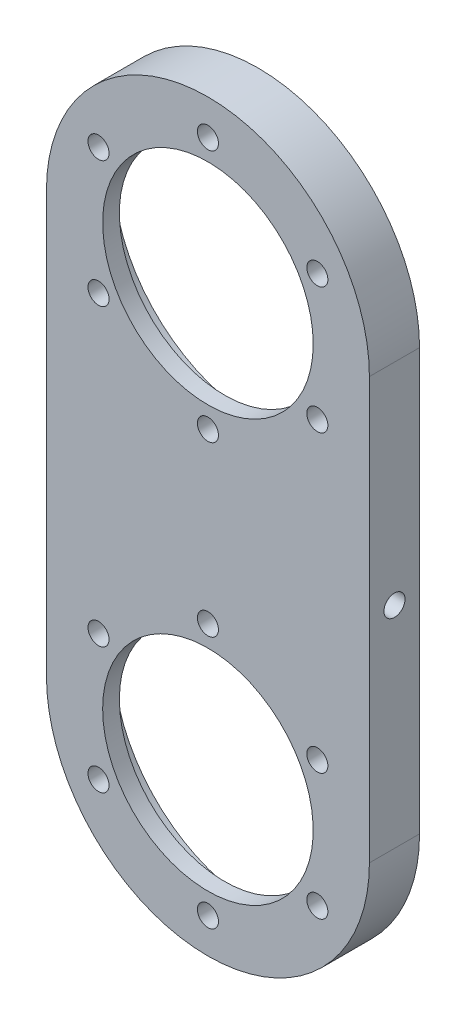
ISO-10303-21;
HEADER;
FILE_DESCRIPTION(('STEP AP214'),'2;1');
FILE_NAME('part.step','',(''),(''),'','','');
FILE_SCHEMA(('AUTOMOTIVE_DESIGN { 1 0 10303 214 1 1 1 1 }'));
ENDSEC;
DATA;
#1=APPLICATION_CONTEXT('core data for automotive mechanical design processes');
#2=APPLICATION_PROTOCOL_DEFINITION('international standard','automotive_design',2000,#1);
#3=PRODUCT_CONTEXT('',#1,'mechanical');
#4=PRODUCT('Part','Part','',(#3));
#5=PRODUCT_RELATED_PRODUCT_CATEGORY('part','',(#4));
#6=PRODUCT_DEFINITION_FORMATION('','',#4);
#7=PRODUCT_DEFINITION_CONTEXT('part definition',#1,'design');
#8=PRODUCT_DEFINITION('design','',#6,#7);
#9=PRODUCT_DEFINITION_SHAPE('','',#8);
#10=(LENGTH_UNIT() NAMED_UNIT(*) SI_UNIT(.MILLI.,.METRE.));
#11=(NAMED_UNIT(*) PLANE_ANGLE_UNIT() SI_UNIT($,.RADIAN.));
#12=(NAMED_UNIT(*) SI_UNIT($,.STERADIAN.) SOLID_ANGLE_UNIT());
#13=UNCERTAINTY_MEASURE_WITH_UNIT(LENGTH_MEASURE(1.E-05),#10,'distance_accuracy_value','');
#14=(GEOMETRIC_REPRESENTATION_CONTEXT(3) GLOBAL_UNCERTAINTY_ASSIGNED_CONTEXT((#13)) GLOBAL_UNIT_ASSIGNED_CONTEXT((#10,
#11,#12)) REPRESENTATION_CONTEXT('',''));
#15=CARTESIAN_POINT('',(0.,0.,0.));
#16=DIRECTION('',(0.,0.,1.));
#17=DIRECTION('',(1.,0.,0.));
#18=AXIS2_PLACEMENT_3D('',#15,#16,#17);
#19=CARTESIAN_POINT('',(0.,-40.,9.525));
#20=DIRECTION('',(0.,0.,-1.));
#21=DIRECTION('',(-1.,0.,0.));
#22=AXIS2_PLACEMENT_3D('',#19,#20,#21);
#23=CYLINDRICAL_SURFACE('',#22,27.5);
#24=CARTESIAN_POINT('',(0.,-40.,0.));
#25=DIRECTION('',(0.,0.,1.));
#26=DIRECTION('',(-1.,0.,0.));
#27=AXIS2_PLACEMENT_3D('',#24,#25,#26);
#28=CIRCLE('',#27,27.5);
#29=CARTESIAN_POINT('',(-27.5,-40.,0.));
#30=VERTEX_POINT('',#29);
#31=EDGE_CURVE('E114',#30,#30,#28,.T.);
#32=CARTESIAN_POINT('',(0.,-40.,6.35));
#33=DIRECTION('',(0.,0.,1.));
#34=DIRECTION('',(1.,0.,0.));
#35=AXIS2_PLACEMENT_3D('',#32,#33,#34);
#36=CIRCLE('',#35,27.5);
#37=CARTESIAN_POINT('',(-27.5,-40.,6.35));
#38=VERTEX_POINT('',#37);
#39=EDGE_CURVE('E123',#38,#38,#36,.T.);
#40=CARTESIAN_POINT('',(-27.5,-40.,0.));
#41=CARTESIAN_POINT('',(-27.5,-40.,0.0661458333333336));
#42=CARTESIAN_POINT('',(-27.5,-40.,0.132291666666667));
#43=CARTESIAN_POINT('',(-27.5,-40.,0.264583333333334));
#44=CARTESIAN_POINT('',(-27.5,-40.,0.330729166666667));
#45=CARTESIAN_POINT('',(-27.5,-40.,0.463020833333333));
#46=CARTESIAN_POINT('',(-27.5,-40.,0.529166666666667));
#47=CARTESIAN_POINT('',(-27.5,-40.,0.661458333333333));
#48=CARTESIAN_POINT('',(-27.5,-40.,0.727604166666666));
#49=CARTESIAN_POINT('',(-27.5,-40.,0.859895833333333));
#50=CARTESIAN_POINT('',(-27.5,-40.,0.926041666666666));
#51=CARTESIAN_POINT('',(-27.5,-40.,1.05833333333333));
#52=CARTESIAN_POINT('',(-27.5,-40.,1.12447916666667));
#53=CARTESIAN_POINT('',(-27.5,-40.,1.25677083333333));
#54=CARTESIAN_POINT('',(-27.5,-40.,1.32291666666667));
#55=CARTESIAN_POINT('',(-27.5,-40.,1.45520833333333));
#56=CARTESIAN_POINT('',(-27.5,-40.,1.52135416666667));
#57=CARTESIAN_POINT('',(-27.5,-40.,1.65364583333333));
#58=CARTESIAN_POINT('',(-27.5,-40.,1.71979166666667));
#59=CARTESIAN_POINT('',(-27.5,-40.,1.85208333333333));
#60=CARTESIAN_POINT('',(-27.5,-40.,1.91822916666667));
#61=CARTESIAN_POINT('',(-27.5,-40.,2.05052083333333));
#62=CARTESIAN_POINT('',(-27.5,-40.,2.11666666666667));
#63=CARTESIAN_POINT('',(-27.5,-40.,2.24895833333333));
#64=CARTESIAN_POINT('',(-27.5,-40.,2.31510416666667));
#65=CARTESIAN_POINT('',(-27.5,-40.,2.44739583333333));
#66=CARTESIAN_POINT('',(-27.5,-40.,2.51354166666667));
#67=CARTESIAN_POINT('',(-27.5,-40.,2.64583333333333));
#68=CARTESIAN_POINT('',(-27.5,-40.,2.71197916666667));
#69=CARTESIAN_POINT('',(-27.5,-40.,2.84427083333333));
#70=CARTESIAN_POINT('',(-27.5,-40.,2.91041666666667));
#71=CARTESIAN_POINT('',(-27.5,-40.,3.04270833333333));
#72=CARTESIAN_POINT('',(-27.5,-40.,3.10885416666667));
#73=CARTESIAN_POINT('',(-27.5,-40.,3.24114583333333));
#74=CARTESIAN_POINT('',(-27.5,-40.,3.30729166666667));
#75=CARTESIAN_POINT('',(-27.5,-40.,3.43958333333333));
#76=CARTESIAN_POINT('',(-27.5,-40.,3.50572916666667));
#77=CARTESIAN_POINT('',(-27.5,-40.,3.63802083333333));
#78=CARTESIAN_POINT('',(-27.5,-40.,3.70416666666667));
#79=CARTESIAN_POINT('',(-27.5,-40.,3.83645833333333));
#80=CARTESIAN_POINT('',(-27.5,-40.,3.90260416666667));
#81=CARTESIAN_POINT('',(-27.5,-40.,4.03489583333333));
#82=CARTESIAN_POINT('',(-27.5,-40.,4.10104166666667));
#83=CARTESIAN_POINT('',(-27.5,-40.,4.23333333333333));
#84=CARTESIAN_POINT('',(-27.5,-40.,4.29947916666667));
#85=CARTESIAN_POINT('',(-27.5,-40.,4.43177083333333));
#86=CARTESIAN_POINT('',(-27.5,-40.,4.49791666666667));
#87=CARTESIAN_POINT('',(-27.5,-40.,4.63020833333333));
#88=CARTESIAN_POINT('',(-27.5,-40.,4.69635416666667));
#89=CARTESIAN_POINT('',(-27.5,-40.,4.82864583333333));
#90=CARTESIAN_POINT('',(-27.5,-40.,4.89479166666667));
#91=CARTESIAN_POINT('',(-27.5,-40.,5.02708333333333));
#92=CARTESIAN_POINT('',(-27.5,-40.,5.09322916666667));
#93=CARTESIAN_POINT('',(-27.5,-40.,5.22552083333333));
#94=CARTESIAN_POINT('',(-27.5,-40.,5.29166666666667));
#95=CARTESIAN_POINT('',(-27.5,-40.,5.42395833333333));
#96=CARTESIAN_POINT('',(-27.5,-40.,5.49010416666667));
#97=CARTESIAN_POINT('',(-27.5,-40.,5.62239583333333));
#98=CARTESIAN_POINT('',(-27.5,-40.,5.68854166666667));
#99=CARTESIAN_POINT('',(-27.5,-40.,5.82083333333333));
#100=CARTESIAN_POINT('',(-27.5,-40.,5.88697916666667));
#101=CARTESIAN_POINT('',(-27.5,-40.,6.01927083333333));
#102=CARTESIAN_POINT('',(-27.5,-40.,6.08541666666667));
#103=CARTESIAN_POINT('',(-27.5,-40.,6.21770833333333));
#104=CARTESIAN_POINT('',(-27.5,-40.,6.28385416666667));
#105=CARTESIAN_POINT('',(-27.5,-40.,6.35));
#106=B_SPLINE_CURVE_WITH_KNOTS('',3,(#40,#41,#42,#43,#44,#45,#46,#47,#48,#49,#50,#51,#52,#53,
#54,#55,#56,#57,#58,#59,#60,#61,#62,#63,#64,#65,#66,#67,#68,#69,#70,#71,#72,#73,#74,#75,#76,#77,
#78,#79,#80,#81,#82,#83,#84,#85,#86,#87,#88,#89,#90,#91,#92,#93,#94,#95,#96,#97,#98,#99,#100,
#101,#102,#103,#104,#105),.UNSPECIFIED.,.F.,.F.,(4,2,2,2,2,2,2,2,2,2,2,2,2,2,2,2,2,2,2,2,2,2,2,
2,2,2,2,2,2,2,2,2,4),(0.,0.198437500000001,0.396875,0.5953125,0.793749999999999,0.9921875,
1.190625,1.3890625,1.5875,1.7859375,1.984375,2.1828125,2.38125,2.5796875,2.778125,2.9765625,
3.175,3.3734375,3.571875,3.7703125,3.96875,4.1671875,4.365625,4.5640625,4.7625,4.9609375,
5.159375,5.3578125,5.55625,5.7546875,5.953125,6.1515625,6.35),.UNSPECIFIED.);
#107=EDGE_CURVE('BSEAM45',#30,#38,#106,.T.);
#108=ORIENTED_EDGE('',*,*,#31,.F.);
#109=ORIENTED_EDGE('',*,*,#39,.T.);
#110=ORIENTED_EDGE('',*,*,#107,.T.);
#111=ORIENTED_EDGE('',*,*,#107,.F.);
#112=EDGE_LOOP('',(#108,#110,#109,#111));
#113=FACE_BOUND('',#112,.T.);
#114=ADVANCED_FACE('F45',(#113),#23,.F.);
#115=CARTESIAN_POINT('',(0.,40.,9.525));
#116=DIRECTION('',(0.,0.,-1.));
#117=DIRECTION('',(-1.,0.,0.));
#118=AXIS2_PLACEMENT_3D('',#115,#116,#117);
#119=CYLINDRICAL_SURFACE('',#118,27.5);
#120=CARTESIAN_POINT('',(0.,40.,0.));
#121=DIRECTION('',(0.,0.,1.));
#122=DIRECTION('',(1.,0.,0.));
#123=AXIS2_PLACEMENT_3D('',#120,#121,#122);
#124=CIRCLE('',#123,27.5);
#125=CARTESIAN_POINT('',(-27.5,40.,0.));
#126=VERTEX_POINT('',#125);
#127=EDGE_CURVE('E128',#126,#126,#124,.T.);
#128=CARTESIAN_POINT('',(0.,40.,6.35));
#129=DIRECTION('',(0.,0.,1.));
#130=DIRECTION('',(1.,0.,0.));
#131=AXIS2_PLACEMENT_3D('',#128,#129,#130);
#132=CIRCLE('',#131,27.5);
#133=CARTESIAN_POINT('',(-27.5,40.,6.35));
#134=VERTEX_POINT('',#133);
#135=EDGE_CURVE('E121',#134,#134,#132,.T.);
#136=CARTESIAN_POINT('',(-27.5,40.,0.));
#137=CARTESIAN_POINT('',(-27.5,40.,0.0661458333333336));
#138=CARTESIAN_POINT('',(-27.5,40.,0.132291666666667));
#139=CARTESIAN_POINT('',(-27.5,40.,0.264583333333334));
#140=CARTESIAN_POINT('',(-27.5,40.,0.330729166666667));
#141=CARTESIAN_POINT('',(-27.5,40.,0.463020833333333));
#142=CARTESIAN_POINT('',(-27.5,40.,0.529166666666667));
#143=CARTESIAN_POINT('',(-27.5,40.,0.661458333333333));
#144=CARTESIAN_POINT('',(-27.5,40.,0.727604166666666));
#145=CARTESIAN_POINT('',(-27.5,40.,0.859895833333333));
#146=CARTESIAN_POINT('',(-27.5,40.,0.926041666666666));
#147=CARTESIAN_POINT('',(-27.5,40.,1.05833333333333));
#148=CARTESIAN_POINT('',(-27.5,40.,1.12447916666667));
#149=CARTESIAN_POINT('',(-27.5,40.,1.25677083333333));
#150=CARTESIAN_POINT('',(-27.5,40.,1.32291666666667));
#151=CARTESIAN_POINT('',(-27.5,40.,1.45520833333333));
#152=CARTESIAN_POINT('',(-27.5,40.,1.52135416666667));
#153=CARTESIAN_POINT('',(-27.5,40.,1.65364583333333));
#154=CARTESIAN_POINT('',(-27.5,40.,1.71979166666667));
#155=CARTESIAN_POINT('',(-27.5,40.,1.85208333333333));
#156=CARTESIAN_POINT('',(-27.5,40.,1.91822916666667));
#157=CARTESIAN_POINT('',(-27.5,40.,2.05052083333333));
#158=CARTESIAN_POINT('',(-27.5,40.,2.11666666666667));
#159=CARTESIAN_POINT('',(-27.5,40.,2.24895833333333));
#160=CARTESIAN_POINT('',(-27.5,40.,2.31510416666667));
#161=CARTESIAN_POINT('',(-27.5,40.,2.44739583333333));
#162=CARTESIAN_POINT('',(-27.5,40.,2.51354166666667));
#163=CARTESIAN_POINT('',(-27.5,40.,2.64583333333333));
#164=CARTESIAN_POINT('',(-27.5,40.,2.71197916666667));
#165=CARTESIAN_POINT('',(-27.5,40.,2.84427083333333));
#166=CARTESIAN_POINT('',(-27.5,40.,2.91041666666667));
#167=CARTESIAN_POINT('',(-27.5,40.,3.04270833333333));
#168=CARTESIAN_POINT('',(-27.5,40.,3.10885416666667));
#169=CARTESIAN_POINT('',(-27.5,40.,3.24114583333333));
#170=CARTESIAN_POINT('',(-27.5,40.,3.30729166666667));
#171=CARTESIAN_POINT('',(-27.5,40.,3.43958333333333));
#172=CARTESIAN_POINT('',(-27.5,40.,3.50572916666667));
#173=CARTESIAN_POINT('',(-27.5,40.,3.63802083333333));
#174=CARTESIAN_POINT('',(-27.5,40.,3.70416666666667));
#175=CARTESIAN_POINT('',(-27.5,40.,3.83645833333333));
#176=CARTESIAN_POINT('',(-27.5,40.,3.90260416666667));
#177=CARTESIAN_POINT('',(-27.5,40.,4.03489583333333));
#178=CARTESIAN_POINT('',(-27.5,40.,4.10104166666667));
#179=CARTESIAN_POINT('',(-27.5,40.,4.23333333333333));
#180=CARTESIAN_POINT('',(-27.5,40.,4.29947916666667));
#181=CARTESIAN_POINT('',(-27.5,40.,4.43177083333333));
#182=CARTESIAN_POINT('',(-27.5,40.,4.49791666666667));
#183=CARTESIAN_POINT('',(-27.5,40.,4.63020833333333));
#184=CARTESIAN_POINT('',(-27.5,40.,4.69635416666667));
#185=CARTESIAN_POINT('',(-27.5,40.,4.82864583333333));
#186=CARTESIAN_POINT('',(-27.5,40.,4.89479166666667));
#187=CARTESIAN_POINT('',(-27.5,40.,5.02708333333333));
#188=CARTESIAN_POINT('',(-27.5,40.,5.09322916666667));
#189=CARTESIAN_POINT('',(-27.5,40.,5.22552083333333));
#190=CARTESIAN_POINT('',(-27.5,40.,5.29166666666667));
#191=CARTESIAN_POINT('',(-27.5,40.,5.42395833333333));
#192=CARTESIAN_POINT('',(-27.5,40.,5.49010416666667));
#193=CARTESIAN_POINT('',(-27.5,40.,5.62239583333333));
#194=CARTESIAN_POINT('',(-27.5,40.,5.68854166666667));
#195=CARTESIAN_POINT('',(-27.5,40.,5.82083333333333));
#196=CARTESIAN_POINT('',(-27.5,40.,5.88697916666667));
#197=CARTESIAN_POINT('',(-27.5,40.,6.01927083333333));
#198=CARTESIAN_POINT('',(-27.5,40.,6.08541666666667));
#199=CARTESIAN_POINT('',(-27.5,40.,6.21770833333333));
#200=CARTESIAN_POINT('',(-27.5,40.,6.28385416666667));
#201=CARTESIAN_POINT('',(-27.5,40.,6.35));
#202=B_SPLINE_CURVE_WITH_KNOTS('',3,(#136,#137,#138,#139,#140,#141,#142,#143,#144,#145,#146,
#147,#148,#149,#150,#151,#152,#153,#154,#155,#156,#157,#158,#159,#160,#161,#162,#163,#164,#165,
#166,#167,#168,#169,#170,#171,#172,#173,#174,#175,#176,#177,#178,#179,#180,#181,#182,#183,#184,
#185,#186,#187,#188,#189,#190,#191,#192,#193,#194,#195,#196,#197,#198,#199,#200,#201),
.UNSPECIFIED.,.F.,.F.,(4,2,2,2,2,2,2,2,2,2,2,2,2,2,2,2,2,2,2,2,2,2,2,2,2,2,2,2,2,2,2,2,4),(0.,
0.198437500000001,0.396875,0.5953125,0.793749999999999,0.9921875,1.190625,1.3890625,1.5875,
1.7859375,1.984375,2.1828125,2.38125,2.5796875,2.778125,2.9765625,3.175,3.3734375,3.571875,
3.7703125,3.96875,4.1671875,4.365625,4.5640625,4.7625,4.9609375,5.159375,5.3578125,5.55625,
5.7546875,5.953125,6.1515625,6.35),.UNSPECIFIED.);
#203=EDGE_CURVE('BSEAM152',#126,#134,#202,.T.);
#204=ORIENTED_EDGE('',*,*,#127,.F.);
#205=ORIENTED_EDGE('',*,*,#135,.T.);
#206=ORIENTED_EDGE('',*,*,#203,.T.);
#207=ORIENTED_EDGE('',*,*,#203,.F.);
#208=EDGE_LOOP('',(#204,#206,#205,#207));
#209=FACE_BOUND('',#208,.T.);
#210=ADVANCED_FACE('F152',(#209),#119,.F.);
#211=CARTESIAN_POINT('',(0.,40.,9.525));
#212=DIRECTION('',(0.,0.,1.));
#213=DIRECTION('',(1.,0.,0.));
#214=AXIS2_PLACEMENT_3D('',#211,#212,#213);
#215=PLANE('',#214);
#216=CARTESIAN_POINT('',(0.,40.,9.525));
#217=DIRECTION('',(0.,0.,1.));
#218=DIRECTION('',(1.,0.,0.));
#219=AXIS2_PLACEMENT_3D('',#216,#217,#218);
#220=CIRCLE('',#219,30.6750002325888);
#221=CARTESIAN_POINT('',(30.6750002325888,40.,9.525));
#222=VERTEX_POINT('',#221);
#223=CARTESIAN_POINT('',(-30.6750002325888,40.,9.525));
#224=VERTEX_POINT('',#223);
#225=EDGE_CURVE('E97',#222,#224,#220,.T.);
#226=ORIENTED_EDGE('',*,*,#225,.T.);
#227=DIRECTION('',(0.,-1.,0.));
#228=VECTOR('',#227,1.);
#229=CARTESIAN_POINT('',(-30.6750002325888,40.,9.525));
#230=LINE('',#229,#228);
#231=CARTESIAN_POINT('',(-30.6750002325888,-40.,9.525));
#232=VERTEX_POINT('',#231);
#233=EDGE_CURVE('E92',#224,#232,#230,.T.);
#234=ORIENTED_EDGE('',*,*,#233,.T.);
#235=CARTESIAN_POINT('',(0.,-40.,9.525));
#236=DIRECTION('',(0.,0.,1.));
#237=DIRECTION('',(1.,0.,0.));
#238=AXIS2_PLACEMENT_3D('',#235,#236,#237);
#239=CIRCLE('',#238,30.6750002325888);
#240=CARTESIAN_POINT('',(30.6750002325888,-40.,9.525));
#241=VERTEX_POINT('',#240);
#242=EDGE_CURVE('E96',#232,#241,#239,.T.);
#243=ORIENTED_EDGE('',*,*,#242,.T.);
#244=DIRECTION('',(0.,1.,0.));
#245=VECTOR('',#244,1.);
#246=CARTESIAN_POINT('',(30.6750002325888,-40.,9.525));
#247=LINE('',#246,#245);
#248=EDGE_CURVE('E64',#241,#222,#247,.T.);
#249=ORIENTED_EDGE('',*,*,#248,.T.);
#250=EDGE_LOOP('',(#226,#234,#243,#249));
#251=FACE_BOUND('',#250,.T.);
#252=CARTESIAN_POINT('',(0.,40.,9.525));
#253=DIRECTION('',(0.,0.,1.));
#254=DIRECTION('',(1.,0.,0.));
#255=AXIS2_PLACEMENT_3D('',#252,#253,#254);
#256=CIRCLE('',#255,20.);
#257=CARTESIAN_POINT('',(20.,40.,9.525));
#258=VERTEX_POINT('',#257);
#259=EDGE_CURVE('E131',#258,#258,#256,.T.);
#260=ORIENTED_EDGE('',*,*,#259,.F.);
#261=EDGE_LOOP('',(#260));
#262=FACE_BOUND('',#261,.T.);
#263=CARTESIAN_POINT('',(0.,64.,9.525));
#264=DIRECTION('',(0.,0.,1.));
#265=DIRECTION('',(1.,0.,0.));
#266=AXIS2_PLACEMENT_3D('',#263,#264,#265);
#267=CIRCLE('',#266,2.00000000000001);
#268=CARTESIAN_POINT('',(2.00000000000001,64.,9.525));
#269=VERTEX_POINT('',#268);
#270=EDGE_CURVE('E139',#269,#269,#267,.T.);
#271=ORIENTED_EDGE('',*,*,#270,.F.);
#272=EDGE_LOOP('',(#271));
#273=FACE_BOUND('',#272,.T.);
#274=CARTESIAN_POINT('',(20.7846096908265,52.,9.525));
#275=DIRECTION('',(0.,0.,1.));
#276=DIRECTION('',(1.,0.,0.));
#277=AXIS2_PLACEMENT_3D('',#274,#275,#276);
#278=CIRCLE('',#277,2.);
#279=CARTESIAN_POINT('',(22.7846096908265,52.,9.525));
#280=VERTEX_POINT('',#279);
#281=EDGE_CURVE('E227',#280,#280,#278,.T.);
#282=ORIENTED_EDGE('',*,*,#281,.F.);
#283=EDGE_LOOP('',(#282));
#284=FACE_BOUND('',#283,.T.);
#285=CARTESIAN_POINT('',(20.7846096908266,28.,9.525));
#286=DIRECTION('',(0.,0.,1.));
#287=DIRECTION('',(1.,0.,0.));
#288=AXIS2_PLACEMENT_3D('',#285,#286,#287);
#289=CIRCLE('',#288,2.);
#290=CARTESIAN_POINT('',(22.7846096908265,28.,9.525));
#291=VERTEX_POINT('',#290);
#292=EDGE_CURVE('E223',#291,#291,#289,.T.);
#293=ORIENTED_EDGE('',*,*,#292,.F.);
#294=EDGE_LOOP('',(#293));
#295=FACE_BOUND('',#294,.T.);
#296=CARTESIAN_POINT('',(0.,16.,9.525));
#297=DIRECTION('',(0.,0.,1.));
#298=DIRECTION('',(1.,0.,0.));
#299=AXIS2_PLACEMENT_3D('',#296,#297,#298);
#300=CIRCLE('',#299,2.);
#301=CARTESIAN_POINT('',(2.00000000000003,16.,9.525));
#302=VERTEX_POINT('',#301);
#303=EDGE_CURVE('E220',#302,#302,#300,.T.);
#304=ORIENTED_EDGE('',*,*,#303,.F.);
#305=EDGE_LOOP('',(#304));
#306=FACE_BOUND('',#305,.T.);
#307=CARTESIAN_POINT('',(-20.7846096908265,28.,9.525));
#308=DIRECTION('',(0.,0.,1.));
#309=DIRECTION('',(1.,0.,0.));
#310=AXIS2_PLACEMENT_3D('',#307,#308,#309);
#311=CIRCLE('',#310,2.00000000000001);
#312=CARTESIAN_POINT('',(-18.7846096908265,28.,9.525));
#313=VERTEX_POINT('',#312);
#314=EDGE_CURVE('E208',#313,#313,#311,.T.);
#315=ORIENTED_EDGE('',*,*,#314,.F.);
#316=EDGE_LOOP('',(#315));
#317=FACE_BOUND('',#316,.T.);
#318=CARTESIAN_POINT('',(-20.7846096908265,52.,9.525));
#319=DIRECTION('',(0.,0.,1.));
#320=DIRECTION('',(1.,0.,0.));
#321=AXIS2_PLACEMENT_3D('',#318,#319,#320);
#322=CIRCLE('',#321,2.00000000000001);
#323=CARTESIAN_POINT('',(-18.7846096908265,52.,9.525));
#324=VERTEX_POINT('',#323);
#325=EDGE_CURVE('E209',#324,#324,#322,.T.);
#326=ORIENTED_EDGE('',*,*,#325,.F.);
#327=EDGE_LOOP('',(#326));
#328=FACE_BOUND('',#327,.T.);
#329=CARTESIAN_POINT('',(-20.7846096908265,-52.,9.525));
#330=DIRECTION('',(0.,0.,1.));
#331=DIRECTION('',(-1.,0.,0.));
#332=AXIS2_PLACEMENT_3D('',#329,#330,#331);
#333=CIRCLE('',#332,2.00000000000001);
#334=CARTESIAN_POINT('',(-22.7846096908265,-52.,9.525));
#335=VERTEX_POINT('',#334);
#336=EDGE_CURVE('E231',#335,#335,#333,.T.);
#337=ORIENTED_EDGE('',*,*,#336,.F.);
#338=EDGE_LOOP('',(#337));
#339=FACE_BOUND('',#338,.T.);
#340=CARTESIAN_POINT('',(-20.7846096908265,-28.,9.525));
#341=DIRECTION('',(0.,0.,1.));
#342=DIRECTION('',(-1.,0.,0.));
#343=AXIS2_PLACEMENT_3D('',#340,#341,#342);
#344=CIRCLE('',#343,2.00000000000001);
#345=CARTESIAN_POINT('',(-22.7846096908265,-28.,9.525));
#346=VERTEX_POINT('',#345);
#347=EDGE_CURVE('E217',#346,#346,#344,.T.);
#348=ORIENTED_EDGE('',*,*,#347,.F.);
#349=EDGE_LOOP('',(#348));
#350=FACE_BOUND('',#349,.T.);
#351=CARTESIAN_POINT('',(0.,-16.,9.525));
#352=DIRECTION('',(0.,0.,1.));
#353=DIRECTION('',(-1.,0.,0.));
#354=AXIS2_PLACEMENT_3D('',#351,#352,#353);
#355=CIRCLE('',#354,2.);
#356=CARTESIAN_POINT('',(-1.99999999999997,-16.,9.525));
#357=VERTEX_POINT('',#356);
#358=EDGE_CURVE('E262',#357,#357,#355,.T.);
#359=ORIENTED_EDGE('',*,*,#358,.F.);
#360=EDGE_LOOP('',(#359));
#361=FACE_BOUND('',#360,.T.);
#362=CARTESIAN_POINT('',(20.7846096908266,-28.,9.525));
#363=DIRECTION('',(0.,0.,1.));
#364=DIRECTION('',(-1.,0.,0.));
#365=AXIS2_PLACEMENT_3D('',#362,#363,#364);
#366=CIRCLE('',#365,2.00000000000001);
#367=CARTESIAN_POINT('',(18.7846096908265,-28.,9.525));
#368=VERTEX_POINT('',#367);
#369=EDGE_CURVE('E266',#368,#368,#366,.T.);
#370=ORIENTED_EDGE('',*,*,#369,.F.);
#371=EDGE_LOOP('',(#370));
#372=FACE_BOUND('',#371,.T.);
#373=CARTESIAN_POINT('',(20.7846096908265,-52.,9.525));
#374=DIRECTION('',(0.,0.,1.));
#375=DIRECTION('',(-1.,0.,0.));
#376=AXIS2_PLACEMENT_3D('',#373,#374,#375);
#377=CIRCLE('',#376,2.);
#378=CARTESIAN_POINT('',(18.7846096908265,-52.,9.525));
#379=VERTEX_POINT('',#378);
#380=EDGE_CURVE('E270',#379,#379,#377,.T.);
#381=ORIENTED_EDGE('',*,*,#380,.F.);
#382=EDGE_LOOP('',(#381));
#383=FACE_BOUND('',#382,.T.);
#384=CARTESIAN_POINT('',(0.,-64.,9.525));
#385=DIRECTION('',(0.,0.,1.));
#386=DIRECTION('',(-1.,0.,0.));
#387=AXIS2_PLACEMENT_3D('',#384,#385,#386);
#388=CIRCLE('',#387,2.);
#389=CARTESIAN_POINT('',(-2.,-64.,9.525));
#390=VERTEX_POINT('',#389);
#391=EDGE_CURVE('E274',#390,#390,#388,.T.);
#392=ORIENTED_EDGE('',*,*,#391,.F.);
#393=EDGE_LOOP('',(#392));
#394=FACE_BOUND('',#393,.T.);
#395=CARTESIAN_POINT('',(0.,-40.,9.525));
#396=DIRECTION('',(0.,0.,1.));
#397=DIRECTION('',(-1.,0.,0.));
#398=AXIS2_PLACEMENT_3D('',#395,#396,#397);
#399=CIRCLE('',#398,20.);
#400=CARTESIAN_POINT('',(-20.,-40.,9.525));
#401=VERTEX_POINT('',#400);
#402=EDGE_CURVE('E277',#401,#401,#399,.T.);
#403=ORIENTED_EDGE('',*,*,#402,.F.);
#404=EDGE_LOOP('',(#403));
#405=FACE_BOUND('',#404,.T.);
#406=ADVANCED_FACE('F93',(#251,#262,#273,#284,#295,#306,#317,#328,#339,#350,#361,#372,#383,#394,
#405),#215,.T.);
#407=CARTESIAN_POINT('',(0.,40.,0.));
#408=DIRECTION('',(0.,0.,1.));
#409=DIRECTION('',(1.,0.,0.));
#410=AXIS2_PLACEMENT_3D('',#407,#408,#409);
#411=PLANE('',#410);
#412=CARTESIAN_POINT('',(0.,40.,0.));
#413=DIRECTION('',(0.,0.,1.));
#414=DIRECTION('',(1.,0.,0.));
#415=AXIS2_PLACEMENT_3D('',#412,#413,#414);
#416=CIRCLE('',#415,30.6750002325888);
#417=CARTESIAN_POINT('',(30.6750002325888,40.,0.));
#418=VERTEX_POINT('',#417);
#419=CARTESIAN_POINT('',(-30.6750002325888,40.,0.));
#420=VERTEX_POINT('',#419);
#421=EDGE_CURVE('E112',#418,#420,#416,.T.);
#422=ORIENTED_EDGE('',*,*,#421,.F.);
#423=DIRECTION('',(0.,1.,0.));
#424=VECTOR('',#423,1.);
#425=CARTESIAN_POINT('',(30.6750002325888,-40.,0.));
#426=LINE('',#425,#424);
#427=CARTESIAN_POINT('',(30.6750002325888,-40.,0.));
#428=VERTEX_POINT('',#427);
#429=EDGE_CURVE('E118',#428,#418,#426,.T.);
#430=ORIENTED_EDGE('',*,*,#429,.F.);
#431=CARTESIAN_POINT('',(0.,-40.,0.));
#432=DIRECTION('',(0.,0.,1.));
#433=DIRECTION('',(1.,0.,0.));
#434=AXIS2_PLACEMENT_3D('',#431,#432,#433);
#435=CIRCLE('',#434,30.6750002325888);
#436=CARTESIAN_POINT('',(-30.6750002325888,-40.,0.));
#437=VERTEX_POINT('',#436);
#438=EDGE_CURVE('E116',#437,#428,#435,.T.);
#439=ORIENTED_EDGE('',*,*,#438,.F.);
#440=DIRECTION('',(0.,-1.,0.));
#441=VECTOR('',#440,1.);
#442=CARTESIAN_POINT('',(-30.6750002325888,40.,0.));
#443=LINE('',#442,#441);
#444=EDGE_CURVE('E103',#420,#437,#443,.T.);
#445=ORIENTED_EDGE('',*,*,#444,.F.);
#446=EDGE_LOOP('',(#422,#430,#439,#445));
#447=FACE_BOUND('',#446,.T.);
#448=ORIENTED_EDGE('',*,*,#31,.T.);
#449=EDGE_LOOP('',(#448));
#450=FACE_BOUND('',#449,.T.);
#451=ORIENTED_EDGE('',*,*,#127,.T.);
#452=EDGE_LOOP('',(#451));
#453=FACE_BOUND('',#452,.T.);
#454=ADVANCED_FACE('F147',(#447,#450,#453),#411,.F.);
#455=CARTESIAN_POINT('',(0.,40.,9.525));
#456=DIRECTION('',(0.,0.,-1.));
#457=DIRECTION('',(-1.,0.,0.));
#458=AXIS2_PLACEMENT_3D('',#455,#456,#457);
#459=CYLINDRICAL_SURFACE('',#458,30.6750002325888);
#460=DIRECTION('',(0.,0.,-1.));
#461=VECTOR('',#460,1.);
#462=CARTESIAN_POINT('',(30.6750002325888,40.,9.525));
#463=LINE('',#462,#461);
#464=EDGE_CURVE('E86',#222,#418,#463,.T.);
#465=ORIENTED_EDGE('',*,*,#464,.T.);
#466=ORIENTED_EDGE('',*,*,#421,.T.);
#467=DIRECTION('',(0.,0.,-1.));
#468=VECTOR('',#467,1.);
#469=CARTESIAN_POINT('',(-30.6750002325888,40.,9.525));
#470=LINE('',#469,#468);
#471=EDGE_CURVE('E11',#224,#420,#470,.T.);
#472=ORIENTED_EDGE('',*,*,#471,.F.);
#473=ORIENTED_EDGE('',*,*,#225,.F.);
#474=EDGE_LOOP('',(#465,#466,#472,#473));
#475=FACE_BOUND('',#474,.T.);
#476=ADVANCED_FACE('F47',(#475),#459,.T.);
#477=CARTESIAN_POINT('',(-30.6750002325888,40.,9.525));
#478=DIRECTION('',(1.,0.,0.));
#479=DIRECTION('',(0.,1.,0.));
#480=AXIS2_PLACEMENT_3D('',#477,#478,#479);
#481=PLANE('',#480);
#482=CARTESIAN_POINT('',(-30.6750002325888,0.,4.7625));
#483=DIRECTION('',(1.,0.,0.));
#484=DIRECTION('',(0.,1.,0.));
#485=AXIS2_PLACEMENT_3D('',#482,#483,#484);
#486=CIRCLE('',#485,2.);
#487=CARTESIAN_POINT('',(-30.6750002325888,0.,2.7625));
#488=VERTEX_POINT('',#487);
#489=EDGE_CURVE('E280',#488,#488,#486,.T.);
#490=ORIENTED_EDGE('',*,*,#489,.T.);
#491=EDGE_LOOP('',(#490));
#492=FACE_BOUND('',#491,.T.);
#493=ORIENTED_EDGE('',*,*,#471,.T.);
#494=ORIENTED_EDGE('',*,*,#444,.T.);
#495=DIRECTION('',(0.,0.,-1.));
#496=VECTOR('',#495,1.);
#497=CARTESIAN_POINT('',(-30.6750002325888,-40.,9.525));
#498=LINE('',#497,#496);
#499=EDGE_CURVE('E55',#232,#437,#498,.T.);
#500=ORIENTED_EDGE('',*,*,#499,.F.);
#501=ORIENTED_EDGE('',*,*,#233,.F.);
#502=EDGE_LOOP('',(#493,#494,#500,#501));
#503=FACE_BOUND('',#502,.T.);
#504=ADVANCED_FACE('F101',(#492,#503),#481,.F.);
#505=CARTESIAN_POINT('',(0.,-40.,9.525));
#506=DIRECTION('',(0.,0.,-1.));
#507=DIRECTION('',(-1.,0.,0.));
#508=AXIS2_PLACEMENT_3D('',#505,#506,#507);
#509=CYLINDRICAL_SURFACE('',#508,30.6750002325888);
#510=ORIENTED_EDGE('',*,*,#499,.T.);
#511=ORIENTED_EDGE('',*,*,#438,.T.);
#512=DIRECTION('',(0.,0.,-1.));
#513=VECTOR('',#512,1.);
#514=CARTESIAN_POINT('',(30.6750002325888,-40.,9.525));
#515=LINE('',#514,#513);
#516=EDGE_CURVE('E79',#241,#428,#515,.T.);
#517=ORIENTED_EDGE('',*,*,#516,.F.);
#518=ORIENTED_EDGE('',*,*,#242,.F.);
#519=EDGE_LOOP('',(#510,#511,#517,#518));
#520=FACE_BOUND('',#519,.T.);
#521=ADVANCED_FACE('F107',(#520),#509,.T.);
#522=CARTESIAN_POINT('',(30.6750002325888,-40.,9.525));
#523=DIRECTION('',(-1.,0.,0.));
#524=DIRECTION('',(0.,0.,1.));
#525=AXIS2_PLACEMENT_3D('',#522,#523,#524);
#526=PLANE('',#525);
#527=CARTESIAN_POINT('',(30.6750002325888,0.,4.7625));
#528=DIRECTION('',(-1.,0.,0.));
#529=DIRECTION('',(0.,0.,1.));
#530=AXIS2_PLACEMENT_3D('',#527,#528,#529);
#531=CIRCLE('',#530,2.);
#532=CARTESIAN_POINT('',(30.6750002325889,0.,2.7625));
#533=VERTEX_POINT('',#532);
#534=EDGE_CURVE('E49',#533,#533,#531,.T.);
#535=ORIENTED_EDGE('',*,*,#534,.T.);
#536=EDGE_LOOP('',(#535));
#537=FACE_BOUND('',#536,.T.);
#538=ORIENTED_EDGE('',*,*,#516,.T.);
#539=ORIENTED_EDGE('',*,*,#429,.T.);
#540=ORIENTED_EDGE('',*,*,#464,.F.);
#541=ORIENTED_EDGE('',*,*,#248,.F.);
#542=EDGE_LOOP('',(#538,#539,#540,#541));
#543=FACE_BOUND('',#542,.T.);
#544=ADVANCED_FACE('F321',(#537,#543),#526,.F.);
#545=CARTESIAN_POINT('',(-20.7846096908265,52.,6.35));
#546=DIRECTION('',(0.,0.,1.));
#547=DIRECTION('',(1.,0.,0.));
#548=AXIS2_PLACEMENT_3D('',#545,#546,#547);
#549=CYLINDRICAL_SURFACE('',#548,2.00000000000001);
#550=CARTESIAN_POINT('',(-20.7846096908265,52.,6.35));
#551=DIRECTION('',(0.,0.,1.));
#552=DIRECTION('',(1.,0.,0.));
#553=AXIS2_PLACEMENT_3D('',#550,#551,#552);
#554=CIRCLE('',#553,2.00000000000001);
#555=CARTESIAN_POINT('',(-18.7846096908265,52.,6.35));
#556=VERTEX_POINT('',#555);
#557=EDGE_CURVE('E206',#556,#556,#554,.T.);
#558=ORIENTED_EDGE('',*,*,#557,.F.);
#559=EDGE_LOOP('',(#558));
#560=FACE_BOUND('',#559,.T.);
#561=ORIENTED_EDGE('',*,*,#325,.T.);
#562=EDGE_LOOP('',(#561));
#563=FACE_BOUND('',#562,.T.);
#564=ADVANCED_FACE('F317',(#560,#563),#549,.F.);
#565=CARTESIAN_POINT('',(-20.7846096908265,28.,6.35));
#566=DIRECTION('',(0.,0.,1.));
#567=DIRECTION('',(1.,0.,0.));
#568=AXIS2_PLACEMENT_3D('',#565,#566,#567);
#569=CYLINDRICAL_SURFACE('',#568,2.00000000000001);
#570=CARTESIAN_POINT('',(-20.7846096908265,28.,6.35));
#571=DIRECTION('',(0.,0.,1.));
#572=DIRECTION('',(1.,0.,0.));
#573=AXIS2_PLACEMENT_3D('',#570,#571,#572);
#574=CIRCLE('',#573,2.00000000000001);
#575=CARTESIAN_POINT('',(-18.7846096908265,28.,6.35));
#576=VERTEX_POINT('',#575);
#577=EDGE_CURVE('E202',#576,#576,#574,.T.);
#578=ORIENTED_EDGE('',*,*,#577,.F.);
#579=EDGE_LOOP('',(#578));
#580=FACE_BOUND('',#579,.T.);
#581=ORIENTED_EDGE('',*,*,#314,.T.);
#582=EDGE_LOOP('',(#581));
#583=FACE_BOUND('',#582,.T.);
#584=ADVANCED_FACE('F320',(#580,#583),#569,.F.);
#585=CARTESIAN_POINT('',(0.,16.,6.35));
#586=DIRECTION('',(0.,0.,1.));
#587=DIRECTION('',(1.,0.,0.));
#588=AXIS2_PLACEMENT_3D('',#585,#586,#587);
#589=CYLINDRICAL_SURFACE('',#588,2.);
#590=CARTESIAN_POINT('',(0.,16.,6.35));
#591=DIRECTION('',(0.,0.,1.));
#592=DIRECTION('',(1.,0.,0.));
#593=AXIS2_PLACEMENT_3D('',#590,#591,#592);
#594=CIRCLE('',#593,2.);
#595=CARTESIAN_POINT('',(2.00000000000003,16.,6.35));
#596=VERTEX_POINT('',#595);
#597=EDGE_CURVE('E198',#596,#596,#594,.T.);
#598=ORIENTED_EDGE('',*,*,#597,.F.);
#599=EDGE_LOOP('',(#598));
#600=FACE_BOUND('',#599,.T.);
#601=ORIENTED_EDGE('',*,*,#303,.T.);
#602=EDGE_LOOP('',(#601));
#603=FACE_BOUND('',#602,.T.);
#604=ADVANCED_FACE('F324',(#600,#603),#589,.F.);
#605=CARTESIAN_POINT('',(20.7846096908266,28.,6.35));
#606=DIRECTION('',(0.,0.,1.));
#607=DIRECTION('',(1.,0.,0.));
#608=AXIS2_PLACEMENT_3D('',#605,#606,#607);
#609=CYLINDRICAL_SURFACE('',#608,2.);
#610=CARTESIAN_POINT('',(20.7846096908266,28.,6.35));
#611=DIRECTION('',(0.,0.,1.));
#612=DIRECTION('',(1.,0.,0.));
#613=AXIS2_PLACEMENT_3D('',#610,#611,#612);
#614=CIRCLE('',#613,2.);
#615=CARTESIAN_POINT('',(22.7846096908265,28.,6.35));
#616=VERTEX_POINT('',#615);
#617=EDGE_CURVE('E194',#616,#616,#614,.T.);
#618=ORIENTED_EDGE('',*,*,#617,.F.);
#619=EDGE_LOOP('',(#618));
#620=FACE_BOUND('',#619,.T.);
#621=ORIENTED_EDGE('',*,*,#292,.T.);
#622=EDGE_LOOP('',(#621));
#623=FACE_BOUND('',#622,.T.);
#624=ADVANCED_FACE('F328',(#620,#623),#609,.F.);
#625=CARTESIAN_POINT('',(20.7846096908265,52.,6.35));
#626=DIRECTION('',(0.,0.,1.));
#627=DIRECTION('',(1.,0.,0.));
#628=AXIS2_PLACEMENT_3D('',#625,#626,#627);
#629=CYLINDRICAL_SURFACE('',#628,2.);
#630=CARTESIAN_POINT('',(20.7846096908265,52.,6.35));
#631=DIRECTION('',(0.,0.,1.));
#632=DIRECTION('',(1.,0.,0.));
#633=AXIS2_PLACEMENT_3D('',#630,#631,#632);
#634=CIRCLE('',#633,2.);
#635=CARTESIAN_POINT('',(22.7846096908265,52.,6.35));
#636=VERTEX_POINT('',#635);
#637=EDGE_CURVE('E190',#636,#636,#634,.T.);
#638=ORIENTED_EDGE('',*,*,#637,.F.);
#639=EDGE_LOOP('',(#638));
#640=FACE_BOUND('',#639,.T.);
#641=ORIENTED_EDGE('',*,*,#281,.T.);
#642=EDGE_LOOP('',(#641));
#643=FACE_BOUND('',#642,.T.);
#644=ADVANCED_FACE('F180',(#640,#643),#629,.F.);
#645=CARTESIAN_POINT('',(0.,64.,6.35));
#646=DIRECTION('',(0.,0.,1.));
#647=DIRECTION('',(1.,0.,0.));
#648=AXIS2_PLACEMENT_3D('',#645,#646,#647);
#649=CYLINDRICAL_SURFACE('',#648,2.00000000000001);
#650=CARTESIAN_POINT('',(0.,64.,6.35));
#651=DIRECTION('',(0.,0.,1.));
#652=DIRECTION('',(1.,0.,0.));
#653=AXIS2_PLACEMENT_3D('',#650,#651,#652);
#654=CIRCLE('',#653,2.00000000000001);
#655=CARTESIAN_POINT('',(2.00000000000001,64.,6.35));
#656=VERTEX_POINT('',#655);
#657=EDGE_CURVE('E136',#656,#656,#654,.T.);
#658=ORIENTED_EDGE('',*,*,#657,.F.);
#659=EDGE_LOOP('',(#658));
#660=FACE_BOUND('',#659,.T.);
#661=ORIENTED_EDGE('',*,*,#270,.T.);
#662=EDGE_LOOP('',(#661));
#663=FACE_BOUND('',#662,.T.);
#664=ADVANCED_FACE('F176',(#660,#663),#649,.F.);
#665=CARTESIAN_POINT('',(0.,-40.,6.35));
#666=DIRECTION('',(0.,0.,1.));
#667=DIRECTION('',(1.,0.,0.));
#668=AXIS2_PLACEMENT_3D('',#665,#666,#667);
#669=PLANE('',#668);
#670=CARTESIAN_POINT('',(0.,40.,6.35));
#671=DIRECTION('',(0.,0.,1.));
#672=DIRECTION('',(1.,0.,0.));
#673=AXIS2_PLACEMENT_3D('',#670,#671,#672);
#674=CIRCLE('',#673,20.);
#675=CARTESIAN_POINT('',(20.,40.,6.35));
#676=VERTEX_POINT('',#675);
#677=EDGE_CURVE('E124',#676,#676,#674,.T.);
#678=ORIENTED_EDGE('',*,*,#677,.T.);
#679=EDGE_LOOP('',(#678));
#680=FACE_BOUND('',#679,.T.);
#681=ORIENTED_EDGE('',*,*,#657,.T.);
#682=EDGE_LOOP('',(#681));
#683=FACE_BOUND('',#682,.T.);
#684=ORIENTED_EDGE('',*,*,#637,.T.);
#685=EDGE_LOOP('',(#684));
#686=FACE_BOUND('',#685,.T.);
#687=ORIENTED_EDGE('',*,*,#617,.T.);
#688=EDGE_LOOP('',(#687));
#689=FACE_BOUND('',#688,.T.);
#690=ORIENTED_EDGE('',*,*,#597,.T.);
#691=EDGE_LOOP('',(#690));
#692=FACE_BOUND('',#691,.T.);
#693=ORIENTED_EDGE('',*,*,#577,.T.);
#694=EDGE_LOOP('',(#693));
#695=FACE_BOUND('',#694,.T.);
#696=ORIENTED_EDGE('',*,*,#557,.T.);
#697=EDGE_LOOP('',(#696));
#698=FACE_BOUND('',#697,.T.);
#699=ORIENTED_EDGE('',*,*,#135,.F.);
#700=EDGE_LOOP('',(#699));
#701=FACE_BOUND('',#700,.T.);
#702=ADVANCED_FACE('F162',(#680,#683,#686,#689,#692,#695,#698,#701),#669,.F.);
#703=CARTESIAN_POINT('',(0.,40.,6.35));
#704=DIRECTION('',(0.,0.,1.));
#705=DIRECTION('',(1.,0.,0.));
#706=AXIS2_PLACEMENT_3D('',#703,#704,#705);
#707=CYLINDRICAL_SURFACE('',#706,20.);
#708=ORIENTED_EDGE('',*,*,#677,.F.);
#709=EDGE_LOOP('',(#708));
#710=FACE_BOUND('',#709,.T.);
#711=ORIENTED_EDGE('',*,*,#259,.T.);
#712=EDGE_LOOP('',(#711));
#713=FACE_BOUND('',#712,.T.);
#714=ADVANCED_FACE('F159',(#710,#713),#707,.F.);
#715=CARTESIAN_POINT('',(-20.7846096908265,-52.,6.35));
#716=DIRECTION('',(0.,0.,1.));
#717=DIRECTION('',(-1.,0.,0.));
#718=AXIS2_PLACEMENT_3D('',#715,#716,#717);
#719=CIRCLE('',#718,2.00000000000001);
#720=CARTESIAN_POINT('',(-22.7846096908265,-52.,6.35));
#721=VERTEX_POINT('',#720);
#722=EDGE_CURVE('E234',#721,#721,#719,.T.);
#723=ORIENTED_EDGE('',*,*,#722,.T.);
#724=EDGE_LOOP('',(#723));
#725=FACE_BOUND('',#724,.T.);
#726=CARTESIAN_POINT('',(-20.7846096908265,-28.,6.35));
#727=DIRECTION('',(0.,0.,1.));
#728=DIRECTION('',(-1.,0.,0.));
#729=AXIS2_PLACEMENT_3D('',#726,#727,#728);
#730=CIRCLE('',#729,2.00000000000001);
#731=CARTESIAN_POINT('',(-22.7846096908265,-28.,6.35));
#732=VERTEX_POINT('',#731);
#733=EDGE_CURVE('E214',#732,#732,#730,.T.);
#734=ORIENTED_EDGE('',*,*,#733,.T.);
#735=EDGE_LOOP('',(#734));
#736=FACE_BOUND('',#735,.T.);
#737=CARTESIAN_POINT('',(0.,-16.,6.35));
#738=DIRECTION('',(0.,0.,1.));
#739=DIRECTION('',(-1.,0.,0.));
#740=AXIS2_PLACEMENT_3D('',#737,#738,#739);
#741=CIRCLE('',#740,2.);
#742=CARTESIAN_POINT('',(-1.99999999999997,-16.,6.35));
#743=VERTEX_POINT('',#742);
#744=EDGE_CURVE('E299',#743,#743,#741,.T.);
#745=ORIENTED_EDGE('',*,*,#744,.T.);
#746=EDGE_LOOP('',(#745));
#747=FACE_BOUND('',#746,.T.);
#748=CARTESIAN_POINT('',(20.7846096908266,-28.,6.35));
#749=DIRECTION('',(0.,0.,1.));
#750=DIRECTION('',(-1.,0.,0.));
#751=AXIS2_PLACEMENT_3D('',#748,#749,#750);
#752=CIRCLE('',#751,2.00000000000001);
#753=CARTESIAN_POINT('',(18.7846096908265,-28.,6.35));
#754=VERTEX_POINT('',#753);
#755=EDGE_CURVE('E295',#754,#754,#752,.T.);
#756=ORIENTED_EDGE('',*,*,#755,.T.);
#757=EDGE_LOOP('',(#756));
#758=FACE_BOUND('',#757,.T.);
#759=CARTESIAN_POINT('',(20.7846096908265,-52.,6.35));
#760=DIRECTION('',(0.,0.,1.));
#761=DIRECTION('',(-1.,0.,0.));
#762=AXIS2_PLACEMENT_3D('',#759,#760,#761);
#763=CIRCLE('',#762,2.);
#764=CARTESIAN_POINT('',(18.7846096908265,-52.,6.35));
#765=VERTEX_POINT('',#764);
#766=EDGE_CURVE('E291',#765,#765,#763,.T.);
#767=ORIENTED_EDGE('',*,*,#766,.T.);
#768=EDGE_LOOP('',(#767));
#769=FACE_BOUND('',#768,.T.);
#770=CARTESIAN_POINT('',(0.,-64.,6.35));
#771=DIRECTION('',(0.,0.,1.));
#772=DIRECTION('',(-1.,0.,0.));
#773=AXIS2_PLACEMENT_3D('',#770,#771,#772);
#774=CIRCLE('',#773,2.);
#775=CARTESIAN_POINT('',(-2.,-64.,6.35));
#776=VERTEX_POINT('',#775);
#777=EDGE_CURVE('E287',#776,#776,#774,.T.);
#778=ORIENTED_EDGE('',*,*,#777,.T.);
#779=EDGE_LOOP('',(#778));
#780=FACE_BOUND('',#779,.T.);
#781=CARTESIAN_POINT('',(0.,-40.,6.35));
#782=DIRECTION('',(0.,0.,1.));
#783=DIRECTION('',(-1.,0.,0.));
#784=AXIS2_PLACEMENT_3D('',#781,#782,#783);
#785=CIRCLE('',#784,20.);
#786=CARTESIAN_POINT('',(-20.,-40.,6.35));
#787=VERTEX_POINT('',#786);
#788=EDGE_CURVE('E279',#787,#787,#785,.T.);
#789=ORIENTED_EDGE('',*,*,#788,.T.);
#790=EDGE_LOOP('',(#789));
#791=FACE_BOUND('',#790,.T.);
#792=ORIENTED_EDGE('',*,*,#39,.F.);
#793=EDGE_LOOP('',(#792));
#794=FACE_BOUND('',#793,.T.);
#795=ADVANCED_FACE('F156',(#725,#736,#747,#758,#769,#780,#791,#794),#669,.F.);
#796=CARTESIAN_POINT('',(-20.7846096908265,-52.,6.35));
#797=DIRECTION('',(0.,0.,1.));
#798=DIRECTION('',(1.,0.,0.));
#799=AXIS2_PLACEMENT_3D('',#796,#797,#798);
#800=CYLINDRICAL_SURFACE('',#799,2.00000000000001);
#801=ORIENTED_EDGE('',*,*,#722,.F.);
#802=EDGE_LOOP('',(#801));
#803=FACE_BOUND('',#802,.T.);
#804=ORIENTED_EDGE('',*,*,#336,.T.);
#805=EDGE_LOOP('',(#804));
#806=FACE_BOUND('',#805,.T.);
#807=ADVANCED_FACE('F158',(#803,#806),#800,.F.);
#808=CARTESIAN_POINT('',(-20.7846096908265,-28.,6.35));
#809=DIRECTION('',(0.,0.,1.));
#810=DIRECTION('',(1.,0.,0.));
#811=AXIS2_PLACEMENT_3D('',#808,#809,#810);
#812=CYLINDRICAL_SURFACE('',#811,2.00000000000001);
#813=ORIENTED_EDGE('',*,*,#733,.F.);
#814=EDGE_LOOP('',(#813));
#815=FACE_BOUND('',#814,.T.);
#816=ORIENTED_EDGE('',*,*,#347,.T.);
#817=EDGE_LOOP('',(#816));
#818=FACE_BOUND('',#817,.T.);
#819=ADVANCED_FACE('F167',(#815,#818),#812,.F.);
#820=CARTESIAN_POINT('',(0.,-16.,6.35));
#821=DIRECTION('',(0.,0.,1.));
#822=DIRECTION('',(1.,0.,0.));
#823=AXIS2_PLACEMENT_3D('',#820,#821,#822);
#824=CYLINDRICAL_SURFACE('',#823,2.);
#825=ORIENTED_EDGE('',*,*,#744,.F.);
#826=EDGE_LOOP('',(#825));
#827=FACE_BOUND('',#826,.T.);
#828=ORIENTED_EDGE('',*,*,#358,.T.);
#829=EDGE_LOOP('',(#828));
#830=FACE_BOUND('',#829,.T.);
#831=ADVANCED_FACE('F306',(#827,#830),#824,.F.);
#832=CARTESIAN_POINT('',(20.7846096908266,-28.,6.35));
#833=DIRECTION('',(0.,0.,1.));
#834=DIRECTION('',(1.,0.,0.));
#835=AXIS2_PLACEMENT_3D('',#832,#833,#834);
#836=CYLINDRICAL_SURFACE('',#835,2.00000000000001);
#837=ORIENTED_EDGE('',*,*,#755,.F.);
#838=EDGE_LOOP('',(#837));
#839=FACE_BOUND('',#838,.T.);
#840=ORIENTED_EDGE('',*,*,#369,.T.);
#841=EDGE_LOOP('',(#840));
#842=FACE_BOUND('',#841,.T.);
#843=ADVANCED_FACE('F312',(#839,#842),#836,.F.);
#844=CARTESIAN_POINT('',(20.7846096908265,-52.,6.35));
#845=DIRECTION('',(0.,0.,1.));
#846=DIRECTION('',(1.,0.,0.));
#847=AXIS2_PLACEMENT_3D('',#844,#845,#846);
#848=CYLINDRICAL_SURFACE('',#847,2.);
#849=ORIENTED_EDGE('',*,*,#766,.F.);
#850=EDGE_LOOP('',(#849));
#851=FACE_BOUND('',#850,.T.);
#852=ORIENTED_EDGE('',*,*,#380,.T.);
#853=EDGE_LOOP('',(#852));
#854=FACE_BOUND('',#853,.T.);
#855=ADVANCED_FACE('F385',(#851,#854),#848,.F.);
#856=CARTESIAN_POINT('',(0.,-64.,6.35));
#857=DIRECTION('',(0.,0.,1.));
#858=DIRECTION('',(1.,0.,0.));
#859=AXIS2_PLACEMENT_3D('',#856,#857,#858);
#860=CYLINDRICAL_SURFACE('',#859,2.);
#861=ORIENTED_EDGE('',*,*,#777,.F.);
#862=EDGE_LOOP('',(#861));
#863=FACE_BOUND('',#862,.T.);
#864=ORIENTED_EDGE('',*,*,#391,.T.);
#865=EDGE_LOOP('',(#864));
#866=FACE_BOUND('',#865,.T.);
#867=ADVANCED_FACE('F394',(#863,#866),#860,.F.);
#868=CARTESIAN_POINT('',(0.,-40.,6.35));
#869=DIRECTION('',(0.,0.,1.));
#870=DIRECTION('',(1.,0.,0.));
#871=AXIS2_PLACEMENT_3D('',#868,#869,#870);
#872=CYLINDRICAL_SURFACE('',#871,20.);
#873=ORIENTED_EDGE('',*,*,#788,.F.);
#874=EDGE_LOOP('',(#873));
#875=FACE_BOUND('',#874,.T.);
#876=ORIENTED_EDGE('',*,*,#402,.T.);
#877=EDGE_LOOP('',(#876));
#878=FACE_BOUND('',#877,.T.);
#879=ADVANCED_FACE('F404',(#875,#878),#872,.F.);
#880=CARTESIAN_POINT('',(-52.5,0.,4.7625));
#881=DIRECTION('',(1.,0.,0.));
#882=DIRECTION('',(0.,0.,-1.));
#883=AXIS2_PLACEMENT_3D('',#880,#881,#882);
#884=CYLINDRICAL_SURFACE('',#883,2.);
#885=CARTESIAN_POINT('',(30.6750002325889,0.,2.7625));
#886=CARTESIAN_POINT('',(30.0359377277433,0.,2.7625));
#887=CARTESIAN_POINT('',(29.3968752228977,0.,2.7625));
#888=CARTESIAN_POINT('',(28.1187502132065,0.,2.7625));
#889=CARTESIAN_POINT('',(27.4796877083609,0.,2.7625));
#890=CARTESIAN_POINT('',(26.2015626986697,0.,2.7625));
#891=CARTESIAN_POINT('',(25.5625001938241,0.,2.7625));
#892=CARTESIAN_POINT('',(24.2843751841328,0.,2.7625));
#893=CARTESIAN_POINT('',(23.6453126792873,0.,2.7625));
#894=CARTESIAN_POINT('',(22.367187669596,0.,2.7625));
#895=CARTESIAN_POINT('',(21.7281251647504,0.,2.7625));
#896=CARTESIAN_POINT('',(20.4500001550592,0.,2.7625));
#897=CARTESIAN_POINT('',(19.8109376502136,0.,2.7625));
#898=CARTESIAN_POINT('',(18.5328126405224,0.,2.7625));
#899=CARTESIAN_POINT('',(17.8937501356768,0.,2.7625));
#900=CARTESIAN_POINT('',(16.6156251259856,0.,2.7625));
#901=CARTESIAN_POINT('',(15.97656262114,0.,2.7625));
#902=CARTESIAN_POINT('',(14.6984376114488,0.,2.7625));
#903=CARTESIAN_POINT('',(14.0593751066032,0.,2.7625));
#904=CARTESIAN_POINT('',(12.781250096912,0.,2.7625));
#905=CARTESIAN_POINT('',(12.1421875920664,0.,2.7625));
#906=CARTESIAN_POINT('',(10.8640625823752,0.,2.7625));
#907=CARTESIAN_POINT('',(10.2250000775296,0.,2.7625));
#908=CARTESIAN_POINT('',(8.94687506783843,0.,2.7625));
#909=CARTESIAN_POINT('',(8.30781256299283,0.,2.7625));
#910=CARTESIAN_POINT('',(7.02968755330162,0.,2.7625));
#911=CARTESIAN_POINT('',(6.39062504845602,0.,2.7625));
#912=CARTESIAN_POINT('',(5.11250003876482,0.,2.7625));
#913=CARTESIAN_POINT('',(4.47343753391922,0.,2.7625));
#914=CARTESIAN_POINT('',(3.19531252422802,0.,2.7625));
#915=CARTESIAN_POINT('',(2.55625001938242,0.,2.7625));
#916=CARTESIAN_POINT('',(1.27812500969122,0.,2.7625));
#917=CARTESIAN_POINT('',(0.639062504845615,0.,2.7625));
#918=CARTESIAN_POINT('',(-0.639062504845587,0.,2.7625));
#919=CARTESIAN_POINT('',(-1.27812500969119,0.,2.7625));
#920=CARTESIAN_POINT('',(-2.55625001938239,0.,2.7625));
#921=CARTESIAN_POINT('',(-3.19531252422799,0.,2.7625));
#922=CARTESIAN_POINT('',(-4.47343753391919,0.,2.7625));
#923=CARTESIAN_POINT('',(-5.11250003876479,0.,2.7625));
#924=CARTESIAN_POINT('',(-6.390625048456,0.,2.7625));
#925=CARTESIAN_POINT('',(-7.0296875533016,0.,2.7625));
#926=CARTESIAN_POINT('',(-8.3078125629928,0.,2.7625));
#927=CARTESIAN_POINT('',(-8.9468750678384,0.,2.7625));
#928=CARTESIAN_POINT('',(-10.2250000775296,0.,2.7625));
#929=CARTESIAN_POINT('',(-10.8640625823752,0.,2.7625));
#930=CARTESIAN_POINT('',(-12.1421875920664,0.,2.7625));
#931=CARTESIAN_POINT('',(-12.781250096912,0.,2.7625));
#932=CARTESIAN_POINT('',(-14.0593751066032,0.,2.7625));
#933=CARTESIAN_POINT('',(-14.6984376114488,0.,2.7625));
#934=CARTESIAN_POINT('',(-15.97656262114,0.,2.7625));
#935=CARTESIAN_POINT('',(-16.6156251259856,0.,2.7625));
#936=CARTESIAN_POINT('',(-17.8937501356768,0.,2.7625));
#937=CARTESIAN_POINT('',(-18.5328126405224,0.,2.7625));
#938=CARTESIAN_POINT('',(-19.8109376502136,0.,2.7625));
#939=CARTESIAN_POINT('',(-20.4500001550592,0.,2.7625));
#940=CARTESIAN_POINT('',(-21.7281251647504,0.,2.7625));
#941=CARTESIAN_POINT('',(-22.367187669596,0.,2.7625));
#942=CARTESIAN_POINT('',(-23.6453126792872,0.,2.7625));
#943=CARTESIAN_POINT('',(-24.2843751841328,0.,2.7625));
#944=CARTESIAN_POINT('',(-25.562500193824,0.,2.7625));
#945=CARTESIAN_POINT('',(-26.2015626986696,0.,2.7625));
#946=CARTESIAN_POINT('',(-27.4796877083608,0.,2.7625));
#947=CARTESIAN_POINT('',(-28.1187502132064,0.,2.7625));
#948=CARTESIAN_POINT('',(-29.3968752228976,0.,2.7625));
#949=CARTESIAN_POINT('',(-30.0359377277432,0.,2.7625));
#950=CARTESIAN_POINT('',(-30.6750002325888,0.,2.7625));
#951=B_SPLINE_CURVE_WITH_KNOTS('',3,(#885,#886,#887,#888,#889,#890,#891,#892,#893,#894,#895,
#896,#897,#898,#899,#900,#901,#902,#903,#904,#905,#906,#907,#908,#909,#910,#911,#912,#913,#914,
#915,#916,#917,#918,#919,#920,#921,#922,#923,#924,#925,#926,#927,#928,#929,#930,#931,#932,#933,
#934,#935,#936,#937,#938,#939,#940,#941,#942,#943,#944,#945,#946,#947,#948,#949,#950),
.UNSPECIFIED.,.F.,.F.,(4,2,2,2,2,2,2,2,2,2,2,2,2,2,2,2,2,2,2,2,2,2,2,2,2,2,2,2,2,2,2,2,4),(0.,
1.9171875145368,3.83437502907361,5.75156254361041,7.66875005814721,9.58593757268401,
11.5031250872208,13.4203126017576,15.3375001162944,17.2546876308312,19.171875145368,
21.0890626599048,23.0062501744416,24.9234376889784,26.8406252035152,28.757812718052,
30.6750002325888,32.5921877471256,34.5093752616624,36.4265627761993,38.3437502907361,
40.2609378052729,42.1781253198097,44.0953128343465,46.0125003488833,47.9296878634201,
49.8468753779569,51.7640628924937,53.6812504070305,55.5984379215673,57.5156254361041,
59.4328129506409,61.3500004651777),.UNSPECIFIED.);
#952=EDGE_CURVE('BSEAM414',#533,#488,#951,.T.);
#953=ORIENTED_EDGE('',*,*,#534,.F.);
#954=ORIENTED_EDGE('',*,*,#489,.F.);
#955=ORIENTED_EDGE('',*,*,#952,.T.);
#956=ORIENTED_EDGE('',*,*,#952,.F.);
#957=EDGE_LOOP('',(#953,#955,#954,#956));
#958=FACE_BOUND('',#957,.T.);
#959=ADVANCED_FACE('F414',(#958),#884,.F.);
#960=CLOSED_SHELL('',(#114,#210,#406,#454,#476,#504,#521,#544,#564,#584,#604,#624,#644,#664,
#702,#714,#795,#807,#819,#831,#843,#855,#867,#879,#959));
#961=MANIFOLD_SOLID_BREP('B2',#960);
#962=ADVANCED_BREP_SHAPE_REPRESENTATION('',(#18,#961),#14);
#963=SHAPE_DEFINITION_REPRESENTATION(#9,#962);
ENDSEC;
END-ISO-10303-21;
